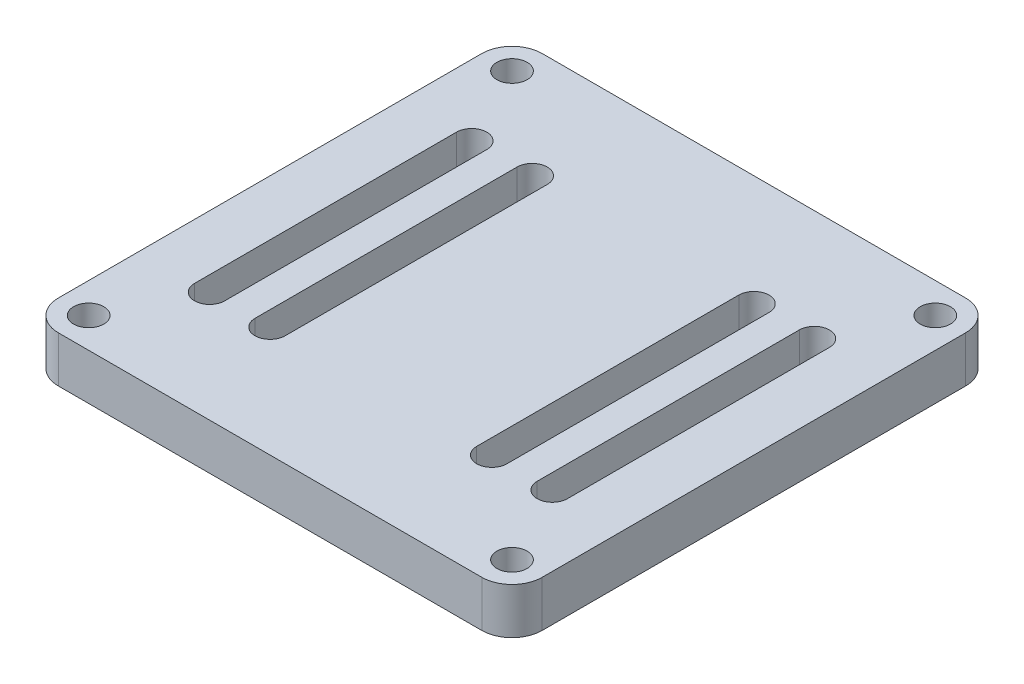
ISO-10303-21;
HEADER;
FILE_DESCRIPTION(('STEP AP214'),'2;1');
FILE_NAME('part.step','',(''),(''),'','','');
FILE_SCHEMA(('AUTOMOTIVE_DESIGN { 1 0 10303 214 1 1 1 1 }'));
ENDSEC;
DATA;
#1=APPLICATION_CONTEXT('core data for automotive mechanical design processes');
#2=APPLICATION_PROTOCOL_DEFINITION('international standard','automotive_design',2000,#1);
#3=PRODUCT_CONTEXT('',#1,'mechanical');
#4=PRODUCT('Part','Part','',(#3));
#5=PRODUCT_RELATED_PRODUCT_CATEGORY('part','',(#4));
#6=PRODUCT_DEFINITION_FORMATION('','',#4);
#7=PRODUCT_DEFINITION_CONTEXT('part definition',#1,'design');
#8=PRODUCT_DEFINITION('design','',#6,#7);
#9=PRODUCT_DEFINITION_SHAPE('','',#8);
#10=(LENGTH_UNIT() NAMED_UNIT(*) SI_UNIT(.MILLI.,.METRE.));
#11=(NAMED_UNIT(*) PLANE_ANGLE_UNIT() SI_UNIT($,.RADIAN.));
#12=(NAMED_UNIT(*) SI_UNIT($,.STERADIAN.) SOLID_ANGLE_UNIT());
#13=UNCERTAINTY_MEASURE_WITH_UNIT(LENGTH_MEASURE(1.E-05),#10,'distance_accuracy_value','');
#14=(GEOMETRIC_REPRESENTATION_CONTEXT(3) GLOBAL_UNCERTAINTY_ASSIGNED_CONTEXT((#13)) GLOBAL_UNIT_ASSIGNED_CONTEXT((#10,
#11,#12)) REPRESENTATION_CONTEXT('',''));
#15=CARTESIAN_POINT('',(0.,0.,0.));
#16=DIRECTION('',(0.,0.,1.));
#17=DIRECTION('',(1.,0.,0.));
#18=AXIS2_PLACEMENT_3D('',#15,#16,#17);
#19=CARTESIAN_POINT('',(3.,4.572,-3.));
#20=DIRECTION('',(0.,-1.,0.));
#21=DIRECTION('',(0.,0.,-1.));
#22=AXIS2_PLACEMENT_3D('',#19,#20,#21);
#23=PLANE('',#22);
#24=CARTESIAN_POINT('',(35.,4.572,-37.));
#25=DIRECTION('',(0.,1.,0.));
#26=DIRECTION('',(0.,0.,1.));
#27=AXIS2_PLACEMENT_3D('',#24,#25,#26);
#28=CIRCLE('',#27,1.5);
#29=CARTESIAN_POINT('',(36.5,4.572,-37.));
#30=VERTEX_POINT('',#29);
#31=CARTESIAN_POINT('',(33.5,4.572,-37.));
#32=VERTEX_POINT('',#31);
#33=EDGE_CURVE('E257',#30,#32,#28,.T.);
#34=ORIENTED_EDGE('',*,*,#33,.F.);
#35=DIRECTION('',(0.,0.,-1.));
#36=VECTOR('',#35,1.);
#37=CARTESIAN_POINT('',(36.5,4.572,-37.));
#38=LINE('',#37,#36);
#39=CARTESIAN_POINT('',(36.5,4.572,-11.));
#40=VERTEX_POINT('',#39);
#41=EDGE_CURVE('E268',#40,#30,#38,.T.);
#42=ORIENTED_EDGE('',*,*,#41,.F.);
#43=CARTESIAN_POINT('',(35.,4.572,-11.));
#44=DIRECTION('',(0.,1.,0.));
#45=DIRECTION('',(0.,0.,1.));
#46=AXIS2_PLACEMENT_3D('',#43,#44,#45);
#47=CIRCLE('',#46,1.5);
#48=CARTESIAN_POINT('',(33.5,4.572,-11.));
#49=VERTEX_POINT('',#48);
#50=EDGE_CURVE('E264',#49,#40,#47,.T.);
#51=ORIENTED_EDGE('',*,*,#50,.F.);
#52=DIRECTION('',(0.,0.,1.));
#53=VECTOR('',#52,1.);
#54=CARTESIAN_POINT('',(33.5,4.572,-37.));
#55=LINE('',#54,#53);
#56=EDGE_CURVE('E260',#32,#49,#55,.T.);
#57=ORIENTED_EDGE('',*,*,#56,.F.);
#58=EDGE_LOOP('',(#34,#42,#51,#57));
#59=FACE_BOUND('',#58,.T.);
#60=CARTESIAN_POINT('',(7.,4.572,-37.));
#61=DIRECTION('',(0.,1.,0.));
#62=DIRECTION('',(0.,0.,1.));
#63=AXIS2_PLACEMENT_3D('',#60,#61,#62);
#64=CIRCLE('',#63,1.5);
#65=CARTESIAN_POINT('',(8.50000000000001,4.572,-37.));
#66=VERTEX_POINT('',#65);
#67=CARTESIAN_POINT('',(5.50000000000001,4.572,-37.));
#68=VERTEX_POINT('',#67);
#69=EDGE_CURVE('E343',#66,#68,#64,.T.);
#70=ORIENTED_EDGE('',*,*,#69,.F.);
#71=DIRECTION('',(0.,0.,-1.));
#72=VECTOR('',#71,1.);
#73=CARTESIAN_POINT('',(8.50000000000001,4.572,-37.));
#74=LINE('',#73,#72);
#75=CARTESIAN_POINT('',(8.50000000000001,4.572,-11.));
#76=VERTEX_POINT('',#75);
#77=EDGE_CURVE('E354',#76,#66,#74,.T.);
#78=ORIENTED_EDGE('',*,*,#77,.F.);
#79=CARTESIAN_POINT('',(7.,4.572,-11.));
#80=DIRECTION('',(0.,1.,0.));
#81=DIRECTION('',(0.,0.,1.));
#82=AXIS2_PLACEMENT_3D('',#79,#80,#81);
#83=CIRCLE('',#82,1.5);
#84=CARTESIAN_POINT('',(5.5,4.572,-11.));
#85=VERTEX_POINT('',#84);
#86=EDGE_CURVE('E350',#85,#76,#83,.T.);
#87=ORIENTED_EDGE('',*,*,#86,.F.);
#88=DIRECTION('',(0.,0.,1.));
#89=VECTOR('',#88,1.);
#90=CARTESIAN_POINT('',(5.50000000000001,4.572,-37.));
#91=LINE('',#90,#89);
#92=EDGE_CURVE('E346',#68,#85,#91,.T.);
#93=ORIENTED_EDGE('',*,*,#92,.F.);
#94=EDGE_LOOP('',(#70,#78,#87,#93));
#95=FACE_BOUND('',#94,.T.);
#96=CARTESIAN_POINT('',(3.,4.572,-3.));
#97=DIRECTION('',(0.,1.,0.));
#98=DIRECTION('',(0.,0.,-1.));
#99=AXIS2_PLACEMENT_3D('',#96,#97,#98);
#100=CIRCLE('',#99,3.);
#101=CARTESIAN_POINT('',(0.,4.572,-3.00000000000002));
#102=VERTEX_POINT('',#101);
#103=CARTESIAN_POINT('',(3.00000000000002,4.572,0.));
#104=VERTEX_POINT('',#103);
#105=EDGE_CURVE('E418',#102,#104,#100,.T.);
#106=ORIENTED_EDGE('',*,*,#105,.T.);
#107=DIRECTION('',(1.,0.,0.));
#108=VECTOR('',#107,1.);
#109=CARTESIAN_POINT('',(3.00000000000002,4.572,0.));
#110=LINE('',#109,#108);
#111=CARTESIAN_POINT('',(45.,4.572,0.));
#112=VERTEX_POINT('',#111);
#113=EDGE_CURVE('E422',#104,#112,#110,.T.);
#114=ORIENTED_EDGE('',*,*,#113,.T.);
#115=CARTESIAN_POINT('',(45.,4.572,-3.));
#116=DIRECTION('',(0.,1.,0.));
#117=DIRECTION('',(0.,0.,1.));
#118=AXIS2_PLACEMENT_3D('',#115,#116,#117);
#119=CIRCLE('',#118,3.);
#120=CARTESIAN_POINT('',(48.,4.572,-3.00000000000002));
#121=VERTEX_POINT('',#120);
#122=EDGE_CURVE('E426',#112,#121,#119,.T.);
#123=ORIENTED_EDGE('',*,*,#122,.T.);
#124=DIRECTION('',(0.,0.,-1.));
#125=VECTOR('',#124,1.);
#126=CARTESIAN_POINT('',(48.,4.572,-3.00000000000002));
#127=LINE('',#126,#125);
#128=CARTESIAN_POINT('',(48.,4.572,-45.));
#129=VERTEX_POINT('',#128);
#130=EDGE_CURVE('E429',#121,#129,#127,.T.);
#131=ORIENTED_EDGE('',*,*,#130,.T.);
#132=CARTESIAN_POINT('',(45.,4.572,-45.));
#133=DIRECTION('',(0.,1.,0.));
#134=DIRECTION('',(0.,0.,-1.));
#135=AXIS2_PLACEMENT_3D('',#132,#133,#134);
#136=CIRCLE('',#135,3.);
#137=CARTESIAN_POINT('',(45.,4.572,-48.));
#138=VERTEX_POINT('',#137);
#139=EDGE_CURVE('E432',#129,#138,#136,.T.);
#140=ORIENTED_EDGE('',*,*,#139,.T.);
#141=DIRECTION('',(-1.,0.,0.));
#142=VECTOR('',#141,1.);
#143=CARTESIAN_POINT('',(3.00000000000002,4.572,-48.));
#144=LINE('',#143,#142);
#145=CARTESIAN_POINT('',(3.00000000000002,4.572,-48.));
#146=VERTEX_POINT('',#145);
#147=EDGE_CURVE('E435',#138,#146,#144,.T.);
#148=ORIENTED_EDGE('',*,*,#147,.T.);
#149=CARTESIAN_POINT('',(3.,4.572,-45.));
#150=DIRECTION('',(0.,1.,0.));
#151=DIRECTION('',(0.,0.,-1.));
#152=AXIS2_PLACEMENT_3D('',#149,#150,#151);
#153=CIRCLE('',#152,3.);
#154=CARTESIAN_POINT('',(0.,4.572,-45.));
#155=VERTEX_POINT('',#154);
#156=EDGE_CURVE('E438',#146,#155,#153,.T.);
#157=ORIENTED_EDGE('',*,*,#156,.T.);
#158=DIRECTION('',(0.,0.,1.));
#159=VECTOR('',#158,1.);
#160=CARTESIAN_POINT('',(0.,4.572,-3.00000000000002));
#161=LINE('',#160,#159);
#162=EDGE_CURVE('E441',#155,#102,#161,.T.);
#163=ORIENTED_EDGE('',*,*,#162,.T.);
#164=EDGE_LOOP('',(#106,#114,#123,#131,#140,#148,#157,#163));
#165=FACE_BOUND('',#164,.T.);
#166=CARTESIAN_POINT('',(3.,4.572,-45.));
#167=DIRECTION('',(0.,1.,0.));
#168=DIRECTION('',(0.,0.,1.));
#169=AXIS2_PLACEMENT_3D('',#166,#167,#168);
#170=CIRCLE('',#169,1.5);
#171=CARTESIAN_POINT('',(3.,4.572,-43.5));
#172=VERTEX_POINT('',#171);
#173=EDGE_CURVE('E410',#172,#172,#170,.T.);
#174=ORIENTED_EDGE('',*,*,#173,.F.);
#175=EDGE_LOOP('',(#174));
#176=FACE_BOUND('',#175,.T.);
#177=CARTESIAN_POINT('',(3.,4.572,-3.));
#178=DIRECTION('',(0.,1.,0.));
#179=DIRECTION('',(0.,0.,-1.));
#180=AXIS2_PLACEMENT_3D('',#177,#178,#179);
#181=CIRCLE('',#180,1.5);
#182=CARTESIAN_POINT('',(3.,4.572,-4.5));
#183=VERTEX_POINT('',#182);
#184=EDGE_CURVE('E402',#183,#183,#181,.T.);
#185=ORIENTED_EDGE('',*,*,#184,.F.);
#186=EDGE_LOOP('',(#185));
#187=FACE_BOUND('',#186,.T.);
#188=CARTESIAN_POINT('',(45.,4.572,-3.));
#189=DIRECTION('',(0.,1.,0.));
#190=DIRECTION('',(0.,0.,1.));
#191=AXIS2_PLACEMENT_3D('',#188,#189,#190);
#192=CIRCLE('',#191,1.5);
#193=CARTESIAN_POINT('',(45.,4.572,-1.5));
#194=VERTEX_POINT('',#193);
#195=EDGE_CURVE('E394',#194,#194,#192,.T.);
#196=ORIENTED_EDGE('',*,*,#195,.F.);
#197=EDGE_LOOP('',(#196));
#198=FACE_BOUND('',#197,.T.);
#199=CARTESIAN_POINT('',(45.,4.572,-45.));
#200=DIRECTION('',(0.,1.,0.));
#201=DIRECTION('',(0.,0.,-1.));
#202=AXIS2_PLACEMENT_3D('',#199,#200,#201);
#203=CIRCLE('',#202,1.5);
#204=CARTESIAN_POINT('',(45.,4.572,-46.5));
#205=VERTEX_POINT('',#204);
#206=EDGE_CURVE('E386',#205,#205,#203,.T.);
#207=ORIENTED_EDGE('',*,*,#206,.F.);
#208=EDGE_LOOP('',(#207));
#209=FACE_BOUND('',#208,.T.);
#210=CARTESIAN_POINT('',(13.,4.572,-37.));
#211=DIRECTION('',(0.,1.,0.));
#212=DIRECTION('',(0.,0.,-1.));
#213=AXIS2_PLACEMENT_3D('',#210,#211,#212);
#214=CIRCLE('',#213,1.5);
#215=CARTESIAN_POINT('',(14.5,4.572,-37.));
#216=VERTEX_POINT('',#215);
#217=CARTESIAN_POINT('',(11.5,4.572,-37.));
#218=VERTEX_POINT('',#217);
#219=EDGE_CURVE('E300',#216,#218,#214,.T.);
#220=ORIENTED_EDGE('',*,*,#219,.F.);
#221=DIRECTION('',(0.,0.,-1.));
#222=VECTOR('',#221,1.);
#223=CARTESIAN_POINT('',(14.5,4.572,-37.));
#224=LINE('',#223,#222);
#225=CARTESIAN_POINT('',(14.5,4.572,-11.));
#226=VERTEX_POINT('',#225);
#227=EDGE_CURVE('E311',#226,#216,#224,.T.);
#228=ORIENTED_EDGE('',*,*,#227,.F.);
#229=CARTESIAN_POINT('',(13.,4.572,-11.));
#230=DIRECTION('',(0.,1.,0.));
#231=DIRECTION('',(0.,0.,-1.));
#232=AXIS2_PLACEMENT_3D('',#229,#230,#231);
#233=CIRCLE('',#232,1.5);
#234=CARTESIAN_POINT('',(11.5,4.572,-11.));
#235=VERTEX_POINT('',#234);
#236=EDGE_CURVE('E307',#235,#226,#233,.T.);
#237=ORIENTED_EDGE('',*,*,#236,.F.);
#238=DIRECTION('',(0.,0.,1.));
#239=VECTOR('',#238,1.);
#240=CARTESIAN_POINT('',(11.5,4.572,-37.));
#241=LINE('',#240,#239);
#242=EDGE_CURVE('E303',#218,#235,#241,.T.);
#243=ORIENTED_EDGE('',*,*,#242,.F.);
#244=EDGE_LOOP('',(#220,#228,#237,#243));
#245=FACE_BOUND('',#244,.T.);
#246=CARTESIAN_POINT('',(41.,4.572,-37.));
#247=DIRECTION('',(0.,1.,0.));
#248=DIRECTION('',(0.,0.,-1.));
#249=AXIS2_PLACEMENT_3D('',#246,#247,#248);
#250=CIRCLE('',#249,1.5);
#251=CARTESIAN_POINT('',(42.5,4.572,-37.));
#252=VERTEX_POINT('',#251);
#253=CARTESIAN_POINT('',(39.5,4.572,-37.));
#254=VERTEX_POINT('',#253);
#255=EDGE_CURVE('E209',#252,#254,#250,.T.);
#256=ORIENTED_EDGE('',*,*,#255,.F.);
#257=DIRECTION('',(0.,0.,-1.));
#258=VECTOR('',#257,1.);
#259=CARTESIAN_POINT('',(42.5,4.572,-37.));
#260=LINE('',#259,#258);
#261=CARTESIAN_POINT('',(42.5,4.572,-11.));
#262=VERTEX_POINT('',#261);
#263=EDGE_CURVE('E235',#262,#252,#260,.T.);
#264=ORIENTED_EDGE('',*,*,#263,.F.);
#265=CARTESIAN_POINT('',(41.,4.572,-11.));
#266=DIRECTION('',(0.,1.,0.));
#267=DIRECTION('',(0.,0.,-1.));
#268=AXIS2_PLACEMENT_3D('',#265,#266,#267);
#269=CIRCLE('',#268,1.5);
#270=CARTESIAN_POINT('',(39.5,4.572,-11.));
#271=VERTEX_POINT('',#270);
#272=EDGE_CURVE('E231',#271,#262,#269,.T.);
#273=ORIENTED_EDGE('',*,*,#272,.F.);
#274=DIRECTION('',(0.,0.,1.));
#275=VECTOR('',#274,1.);
#276=CARTESIAN_POINT('',(39.5,4.572,-37.));
#277=LINE('',#276,#275);
#278=EDGE_CURVE('E218',#254,#271,#277,.T.);
#279=ORIENTED_EDGE('',*,*,#278,.F.);
#280=EDGE_LOOP('',(#256,#264,#273,#279));
#281=FACE_BOUND('',#280,.T.);
#282=ADVANCED_FACE('F47',(#59,#95,#165,#176,#187,#198,#209,#245,#281),#23,.F.);
#283=CARTESIAN_POINT('',(3.,0.,-3.));
#284=DIRECTION('',(0.,-1.,0.));
#285=DIRECTION('',(0.,0.,-1.));
#286=AXIS2_PLACEMENT_3D('',#283,#284,#285);
#287=PLANE('',#286);
#288=CARTESIAN_POINT('',(45.,0.,-3.));
#289=DIRECTION('',(0.,1.,0.));
#290=DIRECTION('',(0.,0.,1.));
#291=AXIS2_PLACEMENT_3D('',#288,#289,#290);
#292=CIRCLE('',#291,1.5);
#293=CARTESIAN_POINT('',(45.,0.,-1.5));
#294=VERTEX_POINT('',#293);
#295=EDGE_CURVE('E390',#294,#294,#292,.T.);
#296=ORIENTED_EDGE('',*,*,#295,.T.);
#297=EDGE_LOOP('',(#296));
#298=FACE_BOUND('',#297,.T.);
#299=CARTESIAN_POINT('',(3.,0.,-45.));
#300=DIRECTION('',(0.,1.,0.));
#301=DIRECTION('',(0.,0.,1.));
#302=AXIS2_PLACEMENT_3D('',#299,#300,#301);
#303=CIRCLE('',#302,1.5);
#304=CARTESIAN_POINT('',(3.,0.,-43.5));
#305=VERTEX_POINT('',#304);
#306=EDGE_CURVE('E406',#305,#305,#303,.T.);
#307=ORIENTED_EDGE('',*,*,#306,.T.);
#308=EDGE_LOOP('',(#307));
#309=FACE_BOUND('',#308,.T.);
#310=CARTESIAN_POINT('',(3.,0.,-3.));
#311=DIRECTION('',(0.,1.,0.));
#312=DIRECTION('',(0.,0.,-1.));
#313=AXIS2_PLACEMENT_3D('',#310,#311,#312);
#314=CIRCLE('',#313,3.);
#315=CARTESIAN_POINT('',(0.,0.,-3.00000000000002));
#316=VERTEX_POINT('',#315);
#317=CARTESIAN_POINT('',(3.00000000000002,0.,0.));
#318=VERTEX_POINT('',#317);
#319=EDGE_CURVE('E414',#316,#318,#314,.T.);
#320=ORIENTED_EDGE('',*,*,#319,.F.);
#321=DIRECTION('',(0.,0.,1.));
#322=VECTOR('',#321,1.);
#323=CARTESIAN_POINT('',(0.,0.,-3.00000000000002));
#324=LINE('',#323,#322);
#325=CARTESIAN_POINT('',(0.,0.,-45.));
#326=VERTEX_POINT('',#325);
#327=EDGE_CURVE('E423',#326,#316,#324,.T.);
#328=ORIENTED_EDGE('',*,*,#327,.F.);
#329=CARTESIAN_POINT('',(3.,0.,-45.));
#330=DIRECTION('',(0.,1.,0.));
#331=DIRECTION('',(0.,0.,-1.));
#332=AXIS2_PLACEMENT_3D('',#329,#330,#331);
#333=CIRCLE('',#332,3.);
#334=CARTESIAN_POINT('',(3.00000000000002,0.,-48.));
#335=VERTEX_POINT('',#334);
#336=EDGE_CURVE('E463',#335,#326,#333,.T.);
#337=ORIENTED_EDGE('',*,*,#336,.F.);
#338=DIRECTION('',(-1.,0.,0.));
#339=VECTOR('',#338,1.);
#340=CARTESIAN_POINT('',(3.00000000000002,0.,-48.));
#341=LINE('',#340,#339);
#342=CARTESIAN_POINT('',(45.,0.,-48.));
#343=VERTEX_POINT('',#342);
#344=EDGE_CURVE('E460',#343,#335,#341,.T.);
#345=ORIENTED_EDGE('',*,*,#344,.F.);
#346=CARTESIAN_POINT('',(45.,0.,-45.));
#347=DIRECTION('',(0.,1.,0.));
#348=DIRECTION('',(0.,0.,-1.));
#349=AXIS2_PLACEMENT_3D('',#346,#347,#348);
#350=CIRCLE('',#349,3.);
#351=CARTESIAN_POINT('',(48.,0.,-45.));
#352=VERTEX_POINT('',#351);
#353=EDGE_CURVE('E457',#352,#343,#350,.T.);
#354=ORIENTED_EDGE('',*,*,#353,.F.);
#355=DIRECTION('',(0.,0.,-1.));
#356=VECTOR('',#355,1.);
#357=CARTESIAN_POINT('',(48.,0.,-3.00000000000002));
#358=LINE('',#357,#356);
#359=CARTESIAN_POINT('',(48.,0.,-3.00000000000002));
#360=VERTEX_POINT('',#359);
#361=EDGE_CURVE('E454',#360,#352,#358,.T.);
#362=ORIENTED_EDGE('',*,*,#361,.F.);
#363=CARTESIAN_POINT('',(45.,0.,-3.));
#364=DIRECTION('',(0.,1.,0.));
#365=DIRECTION('',(0.,0.,1.));
#366=AXIS2_PLACEMENT_3D('',#363,#364,#365);
#367=CIRCLE('',#366,3.);
#368=CARTESIAN_POINT('',(45.,0.,0.));
#369=VERTEX_POINT('',#368);
#370=EDGE_CURVE('E451',#369,#360,#367,.T.);
#371=ORIENTED_EDGE('',*,*,#370,.F.);
#372=DIRECTION('',(1.,0.,0.));
#373=VECTOR('',#372,1.);
#374=CARTESIAN_POINT('',(3.00000000000002,0.,0.));
#375=LINE('',#374,#373);
#376=EDGE_CURVE('E448',#318,#369,#375,.T.);
#377=ORIENTED_EDGE('',*,*,#376,.F.);
#378=EDGE_LOOP('',(#320,#328,#337,#345,#354,#362,#371,#377));
#379=FACE_BOUND('',#378,.T.);
#380=CARTESIAN_POINT('',(3.,0.,-3.));
#381=DIRECTION('',(0.,1.,0.));
#382=DIRECTION('',(0.,0.,-1.));
#383=AXIS2_PLACEMENT_3D('',#380,#381,#382);
#384=CIRCLE('',#383,1.5);
#385=CARTESIAN_POINT('',(3.,0.,-4.5));
#386=VERTEX_POINT('',#385);
#387=EDGE_CURVE('E398',#386,#386,#384,.T.);
#388=ORIENTED_EDGE('',*,*,#387,.T.);
#389=EDGE_LOOP('',(#388));
#390=FACE_BOUND('',#389,.T.);
#391=CARTESIAN_POINT('',(45.,0.,-45.));
#392=DIRECTION('',(0.,1.,0.));
#393=DIRECTION('',(0.,0.,-1.));
#394=AXIS2_PLACEMENT_3D('',#391,#392,#393);
#395=CIRCLE('',#394,1.5);
#396=CARTESIAN_POINT('',(45.,0.,-46.5));
#397=VERTEX_POINT('',#396);
#398=EDGE_CURVE('E385',#397,#397,#395,.T.);
#399=ORIENTED_EDGE('',*,*,#398,.T.);
#400=EDGE_LOOP('',(#399));
#401=FACE_BOUND('',#400,.T.);
#402=DIRECTION('',(0.,0.,-1.));
#403=VECTOR('',#402,1.);
#404=CARTESIAN_POINT('',(8.50000000000001,0.,-37.));
#405=LINE('',#404,#403);
#406=CARTESIAN_POINT('',(8.50000000000001,0.,-11.));
#407=VERTEX_POINT('',#406);
#408=CARTESIAN_POINT('',(8.50000000000001,0.,-37.));
#409=VERTEX_POINT('',#408);
#410=EDGE_CURVE('E347',#407,#409,#405,.T.);
#411=ORIENTED_EDGE('',*,*,#410,.T.);
#412=CARTESIAN_POINT('',(7.,0.,-37.));
#413=DIRECTION('',(0.,1.,0.));
#414=DIRECTION('',(0.,0.,1.));
#415=AXIS2_PLACEMENT_3D('',#412,#413,#414);
#416=CIRCLE('',#415,1.5);
#417=CARTESIAN_POINT('',(5.50000000000001,0.,-37.));
#418=VERTEX_POINT('',#417);
#419=EDGE_CURVE('E342',#409,#418,#416,.T.);
#420=ORIENTED_EDGE('',*,*,#419,.T.);
#421=DIRECTION('',(0.,0.,1.));
#422=VECTOR('',#421,1.);
#423=CARTESIAN_POINT('',(5.50000000000001,0.,-37.));
#424=LINE('',#423,#422);
#425=CARTESIAN_POINT('',(5.5,0.,-11.));
#426=VERTEX_POINT('',#425);
#427=EDGE_CURVE('E361',#418,#426,#424,.T.);
#428=ORIENTED_EDGE('',*,*,#427,.T.);
#429=CARTESIAN_POINT('',(7.,0.,-11.));
#430=DIRECTION('',(0.,1.,0.));
#431=DIRECTION('',(0.,0.,1.));
#432=AXIS2_PLACEMENT_3D('',#429,#430,#431);
#433=CIRCLE('',#432,1.5);
#434=EDGE_CURVE('E365',#426,#407,#433,.T.);
#435=ORIENTED_EDGE('',*,*,#434,.T.);
#436=EDGE_LOOP('',(#411,#420,#428,#435));
#437=FACE_BOUND('',#436,.T.);
#438=DIRECTION('',(0.,0.,-1.));
#439=VECTOR('',#438,1.);
#440=CARTESIAN_POINT('',(14.5,0.,-37.));
#441=LINE('',#440,#439);
#442=CARTESIAN_POINT('',(14.5,0.,-11.));
#443=VERTEX_POINT('',#442);
#444=CARTESIAN_POINT('',(14.5,0.,-37.));
#445=VERTEX_POINT('',#444);
#446=EDGE_CURVE('E304',#443,#445,#441,.T.);
#447=ORIENTED_EDGE('',*,*,#446,.T.);
#448=CARTESIAN_POINT('',(13.,0.,-37.));
#449=DIRECTION('',(0.,1.,0.));
#450=DIRECTION('',(0.,0.,-1.));
#451=AXIS2_PLACEMENT_3D('',#448,#449,#450);
#452=CIRCLE('',#451,1.5);
#453=CARTESIAN_POINT('',(11.5,0.,-37.));
#454=VERTEX_POINT('',#453);
#455=EDGE_CURVE('E299',#445,#454,#452,.T.);
#456=ORIENTED_EDGE('',*,*,#455,.T.);
#457=DIRECTION('',(0.,0.,1.));
#458=VECTOR('',#457,1.);
#459=CARTESIAN_POINT('',(11.5,0.,-37.));
#460=LINE('',#459,#458);
#461=CARTESIAN_POINT('',(11.5,0.,-11.));
#462=VERTEX_POINT('',#461);
#463=EDGE_CURVE('E318',#454,#462,#460,.T.);
#464=ORIENTED_EDGE('',*,*,#463,.T.);
#465=CARTESIAN_POINT('',(13.,0.,-11.));
#466=DIRECTION('',(0.,1.,0.));
#467=DIRECTION('',(0.,0.,-1.));
#468=AXIS2_PLACEMENT_3D('',#465,#466,#467);
#469=CIRCLE('',#468,1.5);
#470=EDGE_CURVE('E322',#462,#443,#469,.T.);
#471=ORIENTED_EDGE('',*,*,#470,.T.);
#472=EDGE_LOOP('',(#447,#456,#464,#471));
#473=FACE_BOUND('',#472,.T.);
#474=DIRECTION('',(0.,0.,-1.));
#475=VECTOR('',#474,1.);
#476=CARTESIAN_POINT('',(36.5,0.,-37.));
#477=LINE('',#476,#475);
#478=CARTESIAN_POINT('',(36.5,0.,-11.));
#479=VERTEX_POINT('',#478);
#480=CARTESIAN_POINT('',(36.5,0.,-37.));
#481=VERTEX_POINT('',#480);
#482=EDGE_CURVE('E261',#479,#481,#477,.T.);
#483=ORIENTED_EDGE('',*,*,#482,.T.);
#484=CARTESIAN_POINT('',(35.,0.,-37.));
#485=DIRECTION('',(0.,1.,0.));
#486=DIRECTION('',(0.,0.,1.));
#487=AXIS2_PLACEMENT_3D('',#484,#485,#486);
#488=CIRCLE('',#487,1.5);
#489=CARTESIAN_POINT('',(33.5,0.,-37.));
#490=VERTEX_POINT('',#489);
#491=EDGE_CURVE('E227',#481,#490,#488,.T.);
#492=ORIENTED_EDGE('',*,*,#491,.T.);
#493=DIRECTION('',(0.,0.,1.));
#494=VECTOR('',#493,1.);
#495=CARTESIAN_POINT('',(33.5,0.,-37.));
#496=LINE('',#495,#494);
#497=CARTESIAN_POINT('',(33.5,0.,-11.));
#498=VERTEX_POINT('',#497);
#499=EDGE_CURVE('E275',#490,#498,#496,.T.);
#500=ORIENTED_EDGE('',*,*,#499,.T.);
#501=CARTESIAN_POINT('',(35.,0.,-11.));
#502=DIRECTION('',(0.,1.,0.));
#503=DIRECTION('',(0.,0.,1.));
#504=AXIS2_PLACEMENT_3D('',#501,#502,#503);
#505=CIRCLE('',#504,1.5);
#506=EDGE_CURVE('E279',#498,#479,#505,.T.);
#507=ORIENTED_EDGE('',*,*,#506,.T.);
#508=EDGE_LOOP('',(#483,#492,#500,#507));
#509=FACE_BOUND('',#508,.T.);
#510=DIRECTION('',(0.,0.,-1.));
#511=VECTOR('',#510,1.);
#512=CARTESIAN_POINT('',(42.5,0.,-37.));
#513=LINE('',#512,#511);
#514=CARTESIAN_POINT('',(42.5,0.,-11.));
#515=VERTEX_POINT('',#514);
#516=CARTESIAN_POINT('',(42.5,0.,-37.));
#517=VERTEX_POINT('',#516);
#518=EDGE_CURVE('E219',#515,#517,#513,.T.);
#519=ORIENTED_EDGE('',*,*,#518,.T.);
#520=CARTESIAN_POINT('',(41.,0.,-37.));
#521=DIRECTION('',(0.,1.,0.));
#522=DIRECTION('',(0.,0.,-1.));
#523=AXIS2_PLACEMENT_3D('',#520,#521,#522);
#524=CIRCLE('',#523,1.5);
#525=CARTESIAN_POINT('',(39.5,0.,-37.));
#526=VERTEX_POINT('',#525);
#527=EDGE_CURVE('E71',#517,#526,#524,.T.);
#528=ORIENTED_EDGE('',*,*,#527,.T.);
#529=DIRECTION('',(0.,0.,1.));
#530=VECTOR('',#529,1.);
#531=CARTESIAN_POINT('',(39.5,0.,-37.));
#532=LINE('',#531,#530);
#533=CARTESIAN_POINT('',(39.5,0.,-11.));
#534=VERTEX_POINT('',#533);
#535=EDGE_CURVE('E225',#526,#534,#532,.T.);
#536=ORIENTED_EDGE('',*,*,#535,.T.);
#537=CARTESIAN_POINT('',(41.,0.,-11.));
#538=DIRECTION('',(0.,1.,0.));
#539=DIRECTION('',(0.,0.,-1.));
#540=AXIS2_PLACEMENT_3D('',#537,#538,#539);
#541=CIRCLE('',#540,1.5);
#542=EDGE_CURVE('E244',#534,#515,#541,.T.);
#543=ORIENTED_EDGE('',*,*,#542,.T.);
#544=EDGE_LOOP('',(#519,#528,#536,#543));
#545=FACE_BOUND('',#544,.T.);
#546=ADVANCED_FACE('F502',(#298,#309,#379,#390,#401,#437,#473,#509,#545),#287,.T.);
#547=CARTESIAN_POINT('',(3.,4.572,-3.));
#548=DIRECTION('',(0.,-1.,0.));
#549=DIRECTION('',(0.,0.,-1.));
#550=AXIS2_PLACEMENT_3D('',#547,#548,#549);
#551=CYLINDRICAL_SURFACE('',#550,3.);
#552=ORIENTED_EDGE('',*,*,#319,.T.);
#553=DIRECTION('',(0.,-1.,0.));
#554=VECTOR('',#553,1.);
#555=CARTESIAN_POINT('',(3.00000000000002,4.572,0.));
#556=LINE('',#555,#554);
#557=EDGE_CURVE('E11',#104,#318,#556,.T.);
#558=ORIENTED_EDGE('',*,*,#557,.F.);
#559=ORIENTED_EDGE('',*,*,#105,.F.);
#560=DIRECTION('',(0.,-1.,0.));
#561=VECTOR('',#560,1.);
#562=CARTESIAN_POINT('',(0.,4.572,-3.00000000000002));
#563=LINE('',#562,#561);
#564=EDGE_CURVE('E444',#102,#316,#563,.T.);
#565=ORIENTED_EDGE('',*,*,#564,.T.);
#566=EDGE_LOOP('',(#552,#558,#559,#565));
#567=FACE_BOUND('',#566,.T.);
#568=ADVANCED_FACE('F49',(#567),#551,.T.);
#569=CARTESIAN_POINT('',(3.00000000000002,4.572,0.));
#570=DIRECTION('',(0.,0.,-1.));
#571=DIRECTION('',(-1.,0.,0.));
#572=AXIS2_PLACEMENT_3D('',#569,#570,#571);
#573=PLANE('',#572);
#574=ORIENTED_EDGE('',*,*,#376,.T.);
#575=DIRECTION('',(0.,-1.,0.));
#576=VECTOR('',#575,1.);
#577=CARTESIAN_POINT('',(45.,4.572,0.));
#578=LINE('',#577,#576);
#579=EDGE_CURVE('E56',#112,#369,#578,.T.);
#580=ORIENTED_EDGE('',*,*,#579,.F.);
#581=ORIENTED_EDGE('',*,*,#113,.F.);
#582=ORIENTED_EDGE('',*,*,#557,.T.);
#583=EDGE_LOOP('',(#574,#580,#581,#582));
#584=FACE_BOUND('',#583,.T.);
#585=ADVANCED_FACE('F520',(#584),#573,.F.);
#586=CARTESIAN_POINT('',(45.,4.572,-3.));
#587=DIRECTION('',(0.,-1.,0.));
#588=DIRECTION('',(0.,0.,-1.));
#589=AXIS2_PLACEMENT_3D('',#586,#587,#588);
#590=CYLINDRICAL_SURFACE('',#589,3.);
#591=ORIENTED_EDGE('',*,*,#370,.T.);
#592=DIRECTION('',(0.,-1.,0.));
#593=VECTOR('',#592,1.);
#594=CARTESIAN_POINT('',(48.,4.572,-3.00000000000002));
#595=LINE('',#594,#593);
#596=EDGE_CURVE('E487',#121,#360,#595,.T.);
#597=ORIENTED_EDGE('',*,*,#596,.F.);
#598=ORIENTED_EDGE('',*,*,#122,.F.);
#599=ORIENTED_EDGE('',*,*,#579,.T.);
#600=EDGE_LOOP('',(#591,#597,#598,#599));
#601=FACE_BOUND('',#600,.T.);
#602=ADVANCED_FACE('F496',(#601),#590,.T.);
#603=CARTESIAN_POINT('',(48.,4.572,-3.00000000000002));
#604=DIRECTION('',(-1.,0.,0.));
#605=DIRECTION('',(0.,0.,1.));
#606=AXIS2_PLACEMENT_3D('',#603,#604,#605);
#607=PLANE('',#606);
#608=ORIENTED_EDGE('',*,*,#361,.T.);
#609=DIRECTION('',(0.,-1.,0.));
#610=VECTOR('',#609,1.);
#611=CARTESIAN_POINT('',(48.,4.572,-45.));
#612=LINE('',#611,#610);
#613=EDGE_CURVE('E483',#129,#352,#612,.T.);
#614=ORIENTED_EDGE('',*,*,#613,.F.);
#615=ORIENTED_EDGE('',*,*,#130,.F.);
#616=ORIENTED_EDGE('',*,*,#596,.T.);
#617=EDGE_LOOP('',(#608,#614,#615,#616));
#618=FACE_BOUND('',#617,.T.);
#619=ADVANCED_FACE('F508',(#618),#607,.F.);
#620=CARTESIAN_POINT('',(45.,4.572,-45.));
#621=DIRECTION('',(0.,-1.,0.));
#622=DIRECTION('',(0.,0.,-1.));
#623=AXIS2_PLACEMENT_3D('',#620,#621,#622);
#624=CYLINDRICAL_SURFACE('',#623,3.);
#625=ORIENTED_EDGE('',*,*,#353,.T.);
#626=DIRECTION('',(0.,-1.,0.));
#627=VECTOR('',#626,1.);
#628=CARTESIAN_POINT('',(45.,4.572,-48.));
#629=LINE('',#628,#627);
#630=EDGE_CURVE('E479',#138,#343,#629,.T.);
#631=ORIENTED_EDGE('',*,*,#630,.F.);
#632=ORIENTED_EDGE('',*,*,#139,.F.);
#633=ORIENTED_EDGE('',*,*,#613,.T.);
#634=EDGE_LOOP('',(#625,#631,#632,#633));
#635=FACE_BOUND('',#634,.T.);
#636=ADVANCED_FACE('F512',(#635),#624,.T.);
#637=CARTESIAN_POINT('',(3.00000000000002,4.572,-48.));
#638=DIRECTION('',(0.,0.,1.));
#639=DIRECTION('',(1.,0.,0.));
#640=AXIS2_PLACEMENT_3D('',#637,#638,#639);
#641=PLANE('',#640);
#642=ORIENTED_EDGE('',*,*,#344,.T.);
#643=DIRECTION('',(0.,-1.,0.));
#644=VECTOR('',#643,1.);
#645=CARTESIAN_POINT('',(3.00000000000002,4.572,-48.));
#646=LINE('',#645,#644);
#647=EDGE_CURVE('E475',#146,#335,#646,.T.);
#648=ORIENTED_EDGE('',*,*,#647,.F.);
#649=ORIENTED_EDGE('',*,*,#147,.F.);
#650=ORIENTED_EDGE('',*,*,#630,.T.);
#651=EDGE_LOOP('',(#642,#648,#649,#650));
#652=FACE_BOUND('',#651,.T.);
#653=ADVANCED_FACE('F533',(#652),#641,.F.);
#654=CARTESIAN_POINT('',(3.,4.572,-45.));
#655=DIRECTION('',(0.,-1.,0.));
#656=DIRECTION('',(0.,0.,-1.));
#657=AXIS2_PLACEMENT_3D('',#654,#655,#656);
#658=CYLINDRICAL_SURFACE('',#657,3.);
#659=ORIENTED_EDGE('',*,*,#336,.T.);
#660=DIRECTION('',(0.,-1.,0.));
#661=VECTOR('',#660,1.);
#662=CARTESIAN_POINT('',(0.,4.572,-45.));
#663=LINE('',#662,#661);
#664=EDGE_CURVE('E471',#155,#326,#663,.T.);
#665=ORIENTED_EDGE('',*,*,#664,.F.);
#666=ORIENTED_EDGE('',*,*,#156,.F.);
#667=ORIENTED_EDGE('',*,*,#647,.T.);
#668=EDGE_LOOP('',(#659,#665,#666,#667));
#669=FACE_BOUND('',#668,.T.);
#670=ADVANCED_FACE('F531',(#669),#658,.T.);
#671=CARTESIAN_POINT('',(0.,4.572,-3.00000000000002));
#672=DIRECTION('',(1.,0.,0.));
#673=DIRECTION('',(0.,0.,-1.));
#674=AXIS2_PLACEMENT_3D('',#671,#672,#673);
#675=PLANE('',#674);
#676=ORIENTED_EDGE('',*,*,#327,.T.);
#677=ORIENTED_EDGE('',*,*,#564,.F.);
#678=ORIENTED_EDGE('',*,*,#162,.F.);
#679=ORIENTED_EDGE('',*,*,#664,.T.);
#680=EDGE_LOOP('',(#676,#677,#678,#679));
#681=FACE_BOUND('',#680,.T.);
#682=ADVANCED_FACE('F526',(#681),#675,.F.);
#683=CARTESIAN_POINT('',(3.,4.572,-45.));
#684=DIRECTION('',(0.,-1.,0.));
#685=DIRECTION('',(0.,0.,-1.));
#686=AXIS2_PLACEMENT_3D('',#683,#684,#685);
#687=CYLINDRICAL_SURFACE('',#686,1.5);
#688=ORIENTED_EDGE('',*,*,#173,.T.);
#689=EDGE_LOOP('',(#688));
#690=FACE_BOUND('',#689,.T.);
#691=ORIENTED_EDGE('',*,*,#306,.F.);
#692=EDGE_LOOP('',(#691));
#693=FACE_BOUND('',#692,.T.);
#694=ADVANCED_FACE('F553',(#690,#693),#687,.F.);
#695=CARTESIAN_POINT('',(3.,4.572,-3.));
#696=DIRECTION('',(0.,-1.,0.));
#697=DIRECTION('',(0.,0.,-1.));
#698=AXIS2_PLACEMENT_3D('',#695,#696,#697);
#699=CYLINDRICAL_SURFACE('',#698,1.5);
#700=ORIENTED_EDGE('',*,*,#184,.T.);
#701=EDGE_LOOP('',(#700));
#702=FACE_BOUND('',#701,.T.);
#703=ORIENTED_EDGE('',*,*,#387,.F.);
#704=EDGE_LOOP('',(#703));
#705=FACE_BOUND('',#704,.T.);
#706=ADVANCED_FACE('F560',(#702,#705),#699,.F.);
#707=CARTESIAN_POINT('',(45.,4.572,-3.));
#708=DIRECTION('',(0.,-1.,0.));
#709=DIRECTION('',(0.,0.,-1.));
#710=AXIS2_PLACEMENT_3D('',#707,#708,#709);
#711=CYLINDRICAL_SURFACE('',#710,1.5);
#712=ORIENTED_EDGE('',*,*,#195,.T.);
#713=EDGE_LOOP('',(#712));
#714=FACE_BOUND('',#713,.T.);
#715=ORIENTED_EDGE('',*,*,#295,.F.);
#716=EDGE_LOOP('',(#715));
#717=FACE_BOUND('',#716,.T.);
#718=ADVANCED_FACE('F565',(#714,#717),#711,.F.);
#719=CARTESIAN_POINT('',(45.,4.572,-45.));
#720=DIRECTION('',(0.,-1.,0.));
#721=DIRECTION('',(0.,0.,-1.));
#722=AXIS2_PLACEMENT_3D('',#719,#720,#721);
#723=CYLINDRICAL_SURFACE('',#722,1.5);
#724=ORIENTED_EDGE('',*,*,#206,.T.);
#725=EDGE_LOOP('',(#724));
#726=FACE_BOUND('',#725,.T.);
#727=ORIENTED_EDGE('',*,*,#398,.F.);
#728=EDGE_LOOP('',(#727));
#729=FACE_BOUND('',#728,.T.);
#730=ADVANCED_FACE('F625',(#726,#729),#723,.F.);
#731=CARTESIAN_POINT('',(7.,4.572,-37.));
#732=DIRECTION('',(0.,-1.,0.));
#733=DIRECTION('',(0.,0.,-1.));
#734=AXIS2_PLACEMENT_3D('',#731,#732,#733);
#735=CYLINDRICAL_SURFACE('',#734,1.5);
#736=ORIENTED_EDGE('',*,*,#419,.F.);
#737=DIRECTION('',(0.,-1.,0.));
#738=VECTOR('',#737,1.);
#739=CARTESIAN_POINT('',(8.50000000000001,4.572,-37.));
#740=LINE('',#739,#738);
#741=EDGE_CURVE('E357',#66,#409,#740,.T.);
#742=ORIENTED_EDGE('',*,*,#741,.F.);
#743=ORIENTED_EDGE('',*,*,#69,.T.);
#744=DIRECTION('',(0.,-1.,0.));
#745=VECTOR('',#744,1.);
#746=CARTESIAN_POINT('',(5.50000000000001,4.572,-37.));
#747=LINE('',#746,#745);
#748=EDGE_CURVE('E381',#68,#418,#747,.T.);
#749=ORIENTED_EDGE('',*,*,#748,.T.);
#750=EDGE_LOOP('',(#736,#742,#743,#749));
#751=FACE_BOUND('',#750,.T.);
#752=ADVANCED_FACE('F621',(#751),#735,.F.);
#753=CARTESIAN_POINT('',(5.50000000000001,4.572,-37.));
#754=DIRECTION('',(1.,0.,0.));
#755=DIRECTION('',(0.,0.,-1.));
#756=AXIS2_PLACEMENT_3D('',#753,#754,#755);
#757=PLANE('',#756);
#758=ORIENTED_EDGE('',*,*,#427,.F.);
#759=ORIENTED_EDGE('',*,*,#748,.F.);
#760=ORIENTED_EDGE('',*,*,#92,.T.);
#761=DIRECTION('',(0.,-1.,0.));
#762=VECTOR('',#761,1.);
#763=CARTESIAN_POINT('',(5.5,4.572,-11.));
#764=LINE('',#763,#762);
#765=EDGE_CURVE('E378',#85,#426,#764,.T.);
#766=ORIENTED_EDGE('',*,*,#765,.T.);
#767=EDGE_LOOP('',(#758,#759,#760,#766));
#768=FACE_BOUND('',#767,.T.);
#769=ADVANCED_FACE('F617',(#768),#757,.T.);
#770=CARTESIAN_POINT('',(7.,4.572,-11.));
#771=DIRECTION('',(0.,-1.,0.));
#772=DIRECTION('',(0.,0.,-1.));
#773=AXIS2_PLACEMENT_3D('',#770,#771,#772);
#774=CYLINDRICAL_SURFACE('',#773,1.5);
#775=ORIENTED_EDGE('',*,*,#434,.F.);
#776=ORIENTED_EDGE('',*,*,#765,.F.);
#777=ORIENTED_EDGE('',*,*,#86,.T.);
#778=DIRECTION('',(0.,-1.,0.));
#779=VECTOR('',#778,1.);
#780=CARTESIAN_POINT('',(8.50000000000001,4.572,-11.));
#781=LINE('',#780,#779);
#782=EDGE_CURVE('E375',#76,#407,#781,.T.);
#783=ORIENTED_EDGE('',*,*,#782,.T.);
#784=EDGE_LOOP('',(#775,#776,#777,#783));
#785=FACE_BOUND('',#784,.T.);
#786=ADVANCED_FACE('F613',(#785),#774,.F.);
#787=CARTESIAN_POINT('',(8.50000000000001,4.572,-37.));
#788=DIRECTION('',(-1.,0.,0.));
#789=DIRECTION('',(0.,0.,1.));
#790=AXIS2_PLACEMENT_3D('',#787,#788,#789);
#791=PLANE('',#790);
#792=ORIENTED_EDGE('',*,*,#410,.F.);
#793=ORIENTED_EDGE('',*,*,#782,.F.);
#794=ORIENTED_EDGE('',*,*,#77,.T.);
#795=ORIENTED_EDGE('',*,*,#741,.T.);
#796=EDGE_LOOP('',(#792,#793,#794,#795));
#797=FACE_BOUND('',#796,.T.);
#798=ADVANCED_FACE('F610',(#797),#791,.T.);
#799=CARTESIAN_POINT('',(13.,4.572,-37.));
#800=DIRECTION('',(0.,-1.,0.));
#801=DIRECTION('',(0.,0.,-1.));
#802=AXIS2_PLACEMENT_3D('',#799,#800,#801);
#803=CYLINDRICAL_SURFACE('',#802,1.5);
#804=ORIENTED_EDGE('',*,*,#455,.F.);
#805=DIRECTION('',(0.,-1.,0.));
#806=VECTOR('',#805,1.);
#807=CARTESIAN_POINT('',(14.5,4.572,-37.));
#808=LINE('',#807,#806);
#809=EDGE_CURVE('E314',#216,#445,#808,.T.);
#810=ORIENTED_EDGE('',*,*,#809,.F.);
#811=ORIENTED_EDGE('',*,*,#219,.T.);
#812=DIRECTION('',(0.,-1.,0.));
#813=VECTOR('',#812,1.);
#814=CARTESIAN_POINT('',(11.5,4.572,-37.));
#815=LINE('',#814,#813);
#816=EDGE_CURVE('E338',#218,#454,#815,.T.);
#817=ORIENTED_EDGE('',*,*,#816,.T.);
#818=EDGE_LOOP('',(#804,#810,#811,#817));
#819=FACE_BOUND('',#818,.T.);
#820=ADVANCED_FACE('F585',(#819),#803,.F.);
#821=CARTESIAN_POINT('',(11.5,4.572,-37.));
#822=DIRECTION('',(1.,0.,0.));
#823=DIRECTION('',(0.,0.,-1.));
#824=AXIS2_PLACEMENT_3D('',#821,#822,#823);
#825=PLANE('',#824);
#826=ORIENTED_EDGE('',*,*,#463,.F.);
#827=ORIENTED_EDGE('',*,*,#816,.F.);
#828=ORIENTED_EDGE('',*,*,#242,.T.);
#829=DIRECTION('',(0.,-1.,0.));
#830=VECTOR('',#829,1.);
#831=CARTESIAN_POINT('',(11.5,4.572,-11.));
#832=LINE('',#831,#830);
#833=EDGE_CURVE('E335',#235,#462,#832,.T.);
#834=ORIENTED_EDGE('',*,*,#833,.T.);
#835=EDGE_LOOP('',(#826,#827,#828,#834));
#836=FACE_BOUND('',#835,.T.);
#837=ADVANCED_FACE('F587',(#836),#825,.T.);
#838=CARTESIAN_POINT('',(13.,4.572,-11.));
#839=DIRECTION('',(0.,-1.,0.));
#840=DIRECTION('',(0.,0.,-1.));
#841=AXIS2_PLACEMENT_3D('',#838,#839,#840);
#842=CYLINDRICAL_SURFACE('',#841,1.5);
#843=ORIENTED_EDGE('',*,*,#470,.F.);
#844=ORIENTED_EDGE('',*,*,#833,.F.);
#845=ORIENTED_EDGE('',*,*,#236,.T.);
#846=DIRECTION('',(0.,-1.,0.));
#847=VECTOR('',#846,1.);
#848=CARTESIAN_POINT('',(14.5,4.572,-11.));
#849=LINE('',#848,#847);
#850=EDGE_CURVE('E332',#226,#443,#849,.T.);
#851=ORIENTED_EDGE('',*,*,#850,.T.);
#852=EDGE_LOOP('',(#843,#844,#845,#851));
#853=FACE_BOUND('',#852,.T.);
#854=ADVANCED_FACE('F596',(#853),#842,.F.);
#855=CARTESIAN_POINT('',(14.5,4.572,-37.));
#856=DIRECTION('',(-1.,0.,0.));
#857=DIRECTION('',(0.,0.,1.));
#858=AXIS2_PLACEMENT_3D('',#855,#856,#857);
#859=PLANE('',#858);
#860=ORIENTED_EDGE('',*,*,#446,.F.);
#861=ORIENTED_EDGE('',*,*,#850,.F.);
#862=ORIENTED_EDGE('',*,*,#227,.T.);
#863=ORIENTED_EDGE('',*,*,#809,.T.);
#864=EDGE_LOOP('',(#860,#861,#862,#863));
#865=FACE_BOUND('',#864,.T.);
#866=ADVANCED_FACE('F594',(#865),#859,.T.);
#867=CARTESIAN_POINT('',(35.,4.572,-37.));
#868=DIRECTION('',(0.,-1.,0.));
#869=DIRECTION('',(0.,0.,-1.));
#870=AXIS2_PLACEMENT_3D('',#867,#868,#869);
#871=CYLINDRICAL_SURFACE('',#870,1.5);
#872=ORIENTED_EDGE('',*,*,#491,.F.);
#873=DIRECTION('',(0.,-1.,0.));
#874=VECTOR('',#873,1.);
#875=CARTESIAN_POINT('',(36.5,4.572,-37.));
#876=LINE('',#875,#874);
#877=EDGE_CURVE('E271',#30,#481,#876,.T.);
#878=ORIENTED_EDGE('',*,*,#877,.F.);
#879=ORIENTED_EDGE('',*,*,#33,.T.);
#880=DIRECTION('',(0.,-1.,0.));
#881=VECTOR('',#880,1.);
#882=CARTESIAN_POINT('',(33.5,4.572,-37.));
#883=LINE('',#882,#881);
#884=EDGE_CURVE('E295',#32,#490,#883,.T.);
#885=ORIENTED_EDGE('',*,*,#884,.T.);
#886=EDGE_LOOP('',(#872,#878,#879,#885));
#887=FACE_BOUND('',#886,.T.);
#888=ADVANCED_FACE('F603',(#887),#871,.F.);
#889=CARTESIAN_POINT('',(33.5,4.572,-37.));
#890=DIRECTION('',(1.,0.,0.));
#891=DIRECTION('',(0.,0.,-1.));
#892=AXIS2_PLACEMENT_3D('',#889,#890,#891);
#893=PLANE('',#892);
#894=ORIENTED_EDGE('',*,*,#499,.F.);
#895=ORIENTED_EDGE('',*,*,#884,.F.);
#896=ORIENTED_EDGE('',*,*,#56,.T.);
#897=DIRECTION('',(0.,-1.,0.));
#898=VECTOR('',#897,1.);
#899=CARTESIAN_POINT('',(33.5,4.572,-11.));
#900=LINE('',#899,#898);
#901=EDGE_CURVE('E292',#49,#498,#900,.T.);
#902=ORIENTED_EDGE('',*,*,#901,.T.);
#903=EDGE_LOOP('',(#894,#895,#896,#902));
#904=FACE_BOUND('',#903,.T.);
#905=ADVANCED_FACE('F693',(#904),#893,.T.);
#906=CARTESIAN_POINT('',(35.,4.572,-11.));
#907=DIRECTION('',(0.,-1.,0.));
#908=DIRECTION('',(0.,0.,-1.));
#909=AXIS2_PLACEMENT_3D('',#906,#907,#908);
#910=CYLINDRICAL_SURFACE('',#909,1.5);
#911=ORIENTED_EDGE('',*,*,#506,.F.);
#912=ORIENTED_EDGE('',*,*,#901,.F.);
#913=ORIENTED_EDGE('',*,*,#50,.T.);
#914=DIRECTION('',(0.,-1.,0.));
#915=VECTOR('',#914,1.);
#916=CARTESIAN_POINT('',(36.5,4.572,-11.));
#917=LINE('',#916,#915);
#918=EDGE_CURVE('E289',#40,#479,#917,.T.);
#919=ORIENTED_EDGE('',*,*,#918,.T.);
#920=EDGE_LOOP('',(#911,#912,#913,#919));
#921=FACE_BOUND('',#920,.T.);
#922=ADVANCED_FACE('F702',(#921),#910,.F.);
#923=CARTESIAN_POINT('',(36.5,4.572,-37.));
#924=DIRECTION('',(-1.,0.,0.));
#925=DIRECTION('',(0.,0.,1.));
#926=AXIS2_PLACEMENT_3D('',#923,#924,#925);
#927=PLANE('',#926);
#928=ORIENTED_EDGE('',*,*,#482,.F.);
#929=ORIENTED_EDGE('',*,*,#918,.F.);
#930=ORIENTED_EDGE('',*,*,#41,.T.);
#931=ORIENTED_EDGE('',*,*,#877,.T.);
#932=EDGE_LOOP('',(#928,#929,#930,#931));
#933=FACE_BOUND('',#932,.T.);
#934=ADVANCED_FACE('F712',(#933),#927,.T.);
#935=CARTESIAN_POINT('',(41.,4.572,-37.));
#936=DIRECTION('',(0.,-1.,0.));
#937=DIRECTION('',(0.,0.,-1.));
#938=AXIS2_PLACEMENT_3D('',#935,#936,#937);
#939=CYLINDRICAL_SURFACE('',#938,1.5);
#940=ORIENTED_EDGE('',*,*,#527,.F.);
#941=DIRECTION('',(0.,-1.,0.));
#942=VECTOR('',#941,1.);
#943=CARTESIAN_POINT('',(42.5,4.572,-37.));
#944=LINE('',#943,#942);
#945=EDGE_CURVE('E213',#252,#517,#944,.T.);
#946=ORIENTED_EDGE('',*,*,#945,.F.);
#947=ORIENTED_EDGE('',*,*,#255,.T.);
#948=DIRECTION('',(0.,-1.,0.));
#949=VECTOR('',#948,1.);
#950=CARTESIAN_POINT('',(39.5,4.572,-37.));
#951=LINE('',#950,#949);
#952=EDGE_CURVE('E212',#254,#526,#951,.T.);
#953=ORIENTED_EDGE('',*,*,#952,.T.);
#954=EDGE_LOOP('',(#940,#946,#947,#953));
#955=FACE_BOUND('',#954,.T.);
#956=ADVANCED_FACE('F211',(#955),#939,.F.);
#957=CARTESIAN_POINT('',(39.5,4.572,-37.));
#958=DIRECTION('',(1.,0.,0.));
#959=DIRECTION('',(0.,0.,-1.));
#960=AXIS2_PLACEMENT_3D('',#957,#958,#959);
#961=PLANE('',#960);
#962=ORIENTED_EDGE('',*,*,#535,.F.);
#963=ORIENTED_EDGE('',*,*,#952,.F.);
#964=ORIENTED_EDGE('',*,*,#278,.T.);
#965=DIRECTION('',(0.,-1.,0.));
#966=VECTOR('',#965,1.);
#967=CARTESIAN_POINT('',(39.5,4.572,-11.));
#968=LINE('',#967,#966);
#969=EDGE_CURVE('E228',#271,#534,#968,.T.);
#970=ORIENTED_EDGE('',*,*,#969,.T.);
#971=EDGE_LOOP('',(#962,#963,#964,#970));
#972=FACE_BOUND('',#971,.T.);
#973=ADVANCED_FACE('F222',(#972),#961,.T.);
#974=CARTESIAN_POINT('',(41.,4.572,-11.));
#975=DIRECTION('',(0.,-1.,0.));
#976=DIRECTION('',(0.,0.,-1.));
#977=AXIS2_PLACEMENT_3D('',#974,#975,#976);
#978=CYLINDRICAL_SURFACE('',#977,1.5);
#979=ORIENTED_EDGE('',*,*,#542,.F.);
#980=ORIENTED_EDGE('',*,*,#969,.F.);
#981=ORIENTED_EDGE('',*,*,#272,.T.);
#982=DIRECTION('',(0.,-1.,0.));
#983=VECTOR('',#982,1.);
#984=CARTESIAN_POINT('',(42.5,4.572,-11.));
#985=LINE('',#984,#983);
#986=EDGE_CURVE('E63',#262,#515,#985,.T.);
#987=ORIENTED_EDGE('',*,*,#986,.T.);
#988=EDGE_LOOP('',(#979,#980,#981,#987));
#989=FACE_BOUND('',#988,.T.);
#990=ADVANCED_FACE('F739',(#989),#978,.F.);
#991=CARTESIAN_POINT('',(42.5,4.572,-37.));
#992=DIRECTION('',(-1.,0.,0.));
#993=DIRECTION('',(0.,0.,1.));
#994=AXIS2_PLACEMENT_3D('',#991,#992,#993);
#995=PLANE('',#994);
#996=ORIENTED_EDGE('',*,*,#518,.F.);
#997=ORIENTED_EDGE('',*,*,#986,.F.);
#998=ORIENTED_EDGE('',*,*,#263,.T.);
#999=ORIENTED_EDGE('',*,*,#945,.T.);
#1000=EDGE_LOOP('',(#996,#997,#998,#999));
#1001=FACE_BOUND('',#1000,.T.);
#1002=ADVANCED_FACE('F748',(#1001),#995,.T.);
#1003=CLOSED_SHELL('',(#282,#546,#568,#585,#602,#619,#636,#653,#670,#682,#694,#706,#718,#730,
#752,#769,#786,#798,#820,#837,#854,#866,#888,#905,#922,#934,#956,#973,#990,#1002));
#1004=MANIFOLD_SOLID_BREP('B2',#1003);
#1005=ADVANCED_BREP_SHAPE_REPRESENTATION('',(#18,#1004),#14);
#1006=SHAPE_DEFINITION_REPRESENTATION(#9,#1005);
ENDSEC;
END-ISO-10303-21;
